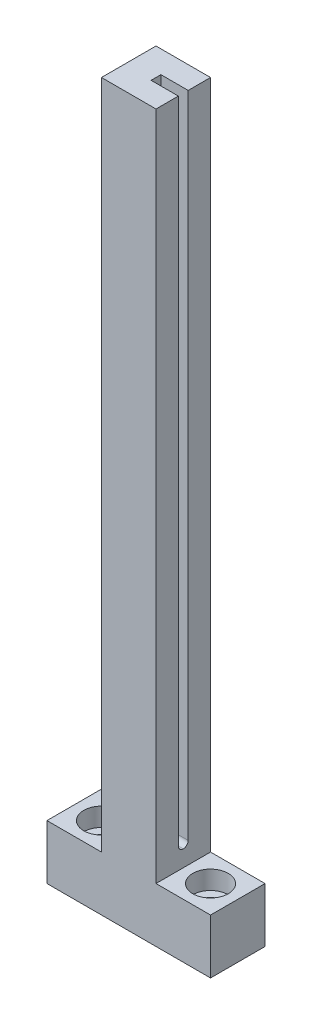
ISO-10303-21;
HEADER;
FILE_DESCRIPTION(('STEP AP214'),'2;1');
FILE_NAME('part.step','',(''),(''),'','','');
FILE_SCHEMA(('AUTOMOTIVE_DESIGN { 1 0 10303 214 1 1 1 1 }'));
ENDSEC;
DATA;
#1=APPLICATION_CONTEXT('core data for automotive mechanical design processes');
#2=APPLICATION_PROTOCOL_DEFINITION('international standard','automotive_design',2000,#1);
#3=PRODUCT_CONTEXT('',#1,'mechanical');
#4=PRODUCT('Part','Part','',(#3));
#5=PRODUCT_RELATED_PRODUCT_CATEGORY('part','',(#4));
#6=PRODUCT_DEFINITION_FORMATION('','',#4);
#7=PRODUCT_DEFINITION_CONTEXT('part definition',#1,'design');
#8=PRODUCT_DEFINITION('design','',#6,#7);
#9=PRODUCT_DEFINITION_SHAPE('','',#8);
#10=(LENGTH_UNIT() NAMED_UNIT(*) SI_UNIT(.MILLI.,.METRE.));
#11=(NAMED_UNIT(*) PLANE_ANGLE_UNIT() SI_UNIT($,.RADIAN.));
#12=(NAMED_UNIT(*) SI_UNIT($,.STERADIAN.) SOLID_ANGLE_UNIT());
#13=UNCERTAINTY_MEASURE_WITH_UNIT(LENGTH_MEASURE(1.E-05),#10,'distance_accuracy_value','');
#14=(GEOMETRIC_REPRESENTATION_CONTEXT(3) GLOBAL_UNCERTAINTY_ASSIGNED_CONTEXT((#13)) GLOBAL_UNIT_ASSIGNED_CONTEXT((#10,
#11,#12)) REPRESENTATION_CONTEXT('',''));
#15=CARTESIAN_POINT('',(0.,0.,0.));
#16=DIRECTION('',(0.,0.,1.));
#17=DIRECTION('',(1.,0.,0.));
#18=AXIS2_PLACEMENT_3D('',#15,#16,#17);
#19=CARTESIAN_POINT('',(5.,133.,-5.));
#20=DIRECTION('',(-1.,0.,0.));
#21=DIRECTION('',(0.,0.,1.));
#22=AXIS2_PLACEMENT_3D('',#19,#20,#21);
#23=PLANE('',#22);
#24=DIRECTION('',(0.,0.,1.));
#25=VECTOR('',#24,1.);
#26=CARTESIAN_POINT('',(5.,9.99999999999999,-5.));
#27=LINE('',#26,#25);
#28=CARTESIAN_POINT('',(5.,9.99999999999999,-5.));
#29=VERTEX_POINT('',#28);
#30=CARTESIAN_POINT('',(5.,10.,5.));
#31=VERTEX_POINT('',#30);
#32=EDGE_CURVE('E60',#29,#31,#27,.T.);
#33=ORIENTED_EDGE('',*,*,#32,.F.);
#34=DIRECTION('',(0.,-1.,0.));
#35=VECTOR('',#34,1.);
#36=CARTESIAN_POINT('',(5.,133.,-5.));
#37=LINE('',#36,#35);
#38=CARTESIAN_POINT('',(5.,133.,-5.));
#39=VERTEX_POINT('',#38);
#40=EDGE_CURVE('E290',#39,#29,#37,.T.);
#41=ORIENTED_EDGE('',*,*,#40,.F.);
#42=DIRECTION('',(0.,0.,-1.));
#43=VECTOR('',#42,1.);
#44=CARTESIAN_POINT('',(5.,133.,-5.));
#45=LINE('',#44,#43);
#46=CARTESIAN_POINT('',(5.,133.,-0.9));
#47=VERTEX_POINT('',#46);
#48=EDGE_CURVE('E267',#47,#39,#45,.T.);
#49=ORIENTED_EDGE('',*,*,#48,.F.);
#50=DIRECTION('',(0.,1.,0.));
#51=VECTOR('',#50,1.);
#52=CARTESIAN_POINT('',(5.,133.,-0.9));
#53=LINE('',#52,#51);
#54=CARTESIAN_POINT('',(5.,13.9,-0.899999999999986));
#55=VERTEX_POINT('',#54);
#56=EDGE_CURVE('E242',#55,#47,#53,.T.);
#57=ORIENTED_EDGE('',*,*,#56,.F.);
#58=CARTESIAN_POINT('',(5.,13.9,0.));
#59=DIRECTION('',(-1.,0.,0.));
#60=DIRECTION('',(0.,0.,1.));
#61=AXIS2_PLACEMENT_3D('',#58,#59,#60);
#62=CIRCLE('',#61,0.9);
#63=CARTESIAN_POINT('',(5.,13.,0.));
#64=VERTEX_POINT('',#63);
#65=EDGE_CURVE('E11',#55,#64,#62,.T.);
#66=ORIENTED_EDGE('',*,*,#65,.T.);
#67=CARTESIAN_POINT('',(5.,13.9,0.));
#68=DIRECTION('',(-1.,0.,0.));
#69=DIRECTION('',(0.,0.,1.));
#70=AXIS2_PLACEMENT_3D('',#67,#68,#69);
#71=CIRCLE('',#70,0.9);
#72=CARTESIAN_POINT('',(5.,13.9,0.899999999999985));
#73=VERTEX_POINT('',#72);
#74=EDGE_CURVE('E53',#64,#73,#71,.T.);
#75=ORIENTED_EDGE('',*,*,#74,.T.);
#76=DIRECTION('',(0.,-1.,0.));
#77=VECTOR('',#76,1.);
#78=CARTESIAN_POINT('',(5.,133.,0.9));
#79=LINE('',#78,#77);
#80=CARTESIAN_POINT('',(5.,133.,0.9));
#81=VERTEX_POINT('',#80);
#82=EDGE_CURVE('E250',#81,#73,#79,.T.);
#83=ORIENTED_EDGE('',*,*,#82,.F.);
#84=CARTESIAN_POINT('',(5.,133.,5.));
#85=VERTEX_POINT('',#84);
#86=EDGE_CURVE('E263',#85,#81,#45,.T.);
#87=ORIENTED_EDGE('',*,*,#86,.F.);
#88=DIRECTION('',(0.,-1.,0.));
#89=VECTOR('',#88,1.);
#90=CARTESIAN_POINT('',(5.,133.,5.));
#91=LINE('',#90,#89);
#92=EDGE_CURVE('E276',#85,#31,#91,.T.);
#93=ORIENTED_EDGE('',*,*,#92,.T.);
#94=EDGE_LOOP('',(#33,#41,#49,#57,#66,#75,#83,#87,#93));
#95=FACE_BOUND('',#94,.T.);
#96=ADVANCED_FACE('F43',(#95),#23,.F.);
#97=CARTESIAN_POINT('',(-5.,133.,-5.));
#98=DIRECTION('',(1.,0.,0.));
#99=DIRECTION('',(0.,0.,-1.));
#100=AXIS2_PLACEMENT_3D('',#97,#98,#99);
#101=PLANE('',#100);
#102=DIRECTION('',(0.,0.,-1.));
#103=VECTOR('',#102,1.);
#104=CARTESIAN_POINT('',(-5.,9.99999999999999,-5.));
#105=LINE('',#104,#103);
#106=CARTESIAN_POINT('',(-5.,9.99999999999999,5.));
#107=VERTEX_POINT('',#106);
#108=CARTESIAN_POINT('',(-5.,10.,-5.));
#109=VERTEX_POINT('',#108);
#110=EDGE_CURVE('E68',#107,#109,#105,.T.);
#111=ORIENTED_EDGE('',*,*,#110,.F.);
#112=DIRECTION('',(0.,-1.,0.));
#113=VECTOR('',#112,1.);
#114=CARTESIAN_POINT('',(-5.,133.,5.));
#115=LINE('',#114,#113);
#116=CARTESIAN_POINT('',(-5.,133.,5.));
#117=VERTEX_POINT('',#116);
#118=EDGE_CURVE('E284',#117,#107,#115,.T.);
#119=ORIENTED_EDGE('',*,*,#118,.F.);
#120=DIRECTION('',(0.,0.,1.));
#121=VECTOR('',#120,1.);
#122=CARTESIAN_POINT('',(-5.,133.,-5.));
#123=LINE('',#122,#121);
#124=CARTESIAN_POINT('',(-5.,133.,-5.));
#125=VERTEX_POINT('',#124);
#126=EDGE_CURVE('E270',#125,#117,#123,.T.);
#127=ORIENTED_EDGE('',*,*,#126,.F.);
#128=DIRECTION('',(0.,-1.,0.));
#129=VECTOR('',#128,1.);
#130=CARTESIAN_POINT('',(-5.,133.,-5.));
#131=LINE('',#130,#129);
#132=EDGE_CURVE('E287',#125,#109,#131,.T.);
#133=ORIENTED_EDGE('',*,*,#132,.T.);
#134=EDGE_LOOP('',(#111,#119,#127,#133));
#135=FACE_BOUND('',#134,.T.);
#136=ADVANCED_FACE('F415',(#135),#101,.F.);
#137=CARTESIAN_POINT('',(-5.,133.,-5.));
#138=DIRECTION('',(0.,0.,1.));
#139=DIRECTION('',(1.,0.,0.));
#140=AXIS2_PLACEMENT_3D('',#137,#138,#139);
#141=PLANE('',#140);
#142=DIRECTION('',(-1.,0.,0.));
#143=VECTOR('',#142,1.);
#144=CARTESIAN_POINT('',(-5.,0.,-5.));
#145=LINE('',#144,#143);
#146=CARTESIAN_POINT('',(15.,0.,-5.));
#147=VERTEX_POINT('',#146);
#148=CARTESIAN_POINT('',(-15.,0.,-5.));
#149=VERTEX_POINT('',#148);
#150=EDGE_CURVE('E259',#147,#149,#145,.T.);
#151=ORIENTED_EDGE('',*,*,#150,.T.);
#152=DIRECTION('',(0.,1.,0.));
#153=VECTOR('',#152,1.);
#154=CARTESIAN_POINT('',(-15.,0.,-5.));
#155=LINE('',#154,#153);
#156=CARTESIAN_POINT('',(-15.,10.,-5.));
#157=VERTEX_POINT('',#156);
#158=EDGE_CURVE('E218',#149,#157,#155,.T.);
#159=ORIENTED_EDGE('',*,*,#158,.T.);
#160=DIRECTION('',(-1.,0.,0.));
#161=VECTOR('',#160,1.);
#162=CARTESIAN_POINT('',(15.,10.,-5.));
#163=LINE('',#162,#161);
#164=EDGE_CURVE('E229',#109,#157,#163,.T.);
#165=ORIENTED_EDGE('',*,*,#164,.F.);
#166=ORIENTED_EDGE('',*,*,#132,.F.);
#167=DIRECTION('',(-1.,0.,0.));
#168=VECTOR('',#167,1.);
#169=CARTESIAN_POINT('',(-5.,133.,-5.));
#170=LINE('',#169,#168);
#171=EDGE_CURVE('E266',#39,#125,#170,.T.);
#172=ORIENTED_EDGE('',*,*,#171,.F.);
#173=ORIENTED_EDGE('',*,*,#40,.T.);
#174=CARTESIAN_POINT('',(15.,10.,-5.));
#175=VERTEX_POINT('',#174);
#176=EDGE_CURVE('E230',#175,#29,#163,.T.);
#177=ORIENTED_EDGE('',*,*,#176,.F.);
#178=DIRECTION('',(0.,1.,0.));
#179=VECTOR('',#178,1.);
#180=CARTESIAN_POINT('',(15.,0.,-5.));
#181=LINE('',#180,#179);
#182=EDGE_CURVE('E204',#147,#175,#181,.T.);
#183=ORIENTED_EDGE('',*,*,#182,.F.);
#184=EDGE_LOOP('',(#151,#159,#165,#166,#172,#173,#177,#183));
#185=FACE_BOUND('',#184,.T.);
#186=ADVANCED_FACE('F411',(#185),#141,.F.);
#187=CARTESIAN_POINT('',(-5.,133.,5.));
#188=DIRECTION('',(0.,0.,-1.));
#189=DIRECTION('',(-1.,0.,0.));
#190=AXIS2_PLACEMENT_3D('',#187,#188,#189);
#191=PLANE('',#190);
#192=DIRECTION('',(1.,0.,0.));
#193=VECTOR('',#192,1.);
#194=CARTESIAN_POINT('',(-5.,0.,5.));
#195=LINE('',#194,#193);
#196=CARTESIAN_POINT('',(-15.,0.,5.));
#197=VERTEX_POINT('',#196);
#198=CARTESIAN_POINT('',(15.,0.,5.));
#199=VERTEX_POINT('',#198);
#200=EDGE_CURVE('E279',#197,#199,#195,.T.);
#201=ORIENTED_EDGE('',*,*,#200,.T.);
#202=DIRECTION('',(0.,-1.,0.));
#203=VECTOR('',#202,1.);
#204=CARTESIAN_POINT('',(15.,0.,5.));
#205=LINE('',#204,#203);
#206=CARTESIAN_POINT('',(15.,10.,5.));
#207=VERTEX_POINT('',#206);
#208=EDGE_CURVE('E195',#207,#199,#205,.T.);
#209=ORIENTED_EDGE('',*,*,#208,.F.);
#210=DIRECTION('',(-1.,0.,0.));
#211=VECTOR('',#210,1.);
#212=CARTESIAN_POINT('',(15.,10.,5.));
#213=LINE('',#212,#211);
#214=EDGE_CURVE('E225',#207,#31,#213,.T.);
#215=ORIENTED_EDGE('',*,*,#214,.T.);
#216=ORIENTED_EDGE('',*,*,#92,.F.);
#217=DIRECTION('',(1.,0.,0.));
#218=VECTOR('',#217,1.);
#219=CARTESIAN_POINT('',(-5.,133.,5.));
#220=LINE('',#219,#218);
#221=EDGE_CURVE('E273',#117,#85,#220,.T.);
#222=ORIENTED_EDGE('',*,*,#221,.F.);
#223=ORIENTED_EDGE('',*,*,#118,.T.);
#224=CARTESIAN_POINT('',(-15.,10.,5.));
#225=VERTEX_POINT('',#224);
#226=EDGE_CURVE('E210',#107,#225,#213,.T.);
#227=ORIENTED_EDGE('',*,*,#226,.T.);
#228=DIRECTION('',(0.,-1.,0.));
#229=VECTOR('',#228,1.);
#230=CARTESIAN_POINT('',(-15.,0.,5.));
#231=LINE('',#230,#229);
#232=EDGE_CURVE('E194',#225,#197,#231,.T.);
#233=ORIENTED_EDGE('',*,*,#232,.T.);
#234=EDGE_LOOP('',(#201,#209,#215,#216,#222,#223,#227,#233));
#235=FACE_BOUND('',#234,.T.);
#236=ADVANCED_FACE('F386',(#235),#191,.F.);
#237=CARTESIAN_POINT('',(0.,133.,0.));
#238=DIRECTION('',(0.,1.,0.));
#239=DIRECTION('',(0.,0.,1.));
#240=AXIS2_PLACEMENT_3D('',#237,#238,#239);
#241=PLANE('',#240);
#242=DIRECTION('',(1.,0.,0.));
#243=VECTOR('',#242,1.);
#244=CARTESIAN_POINT('',(0.,133.,0.9));
#245=LINE('',#244,#243);
#246=CARTESIAN_POINT('',(0.,133.,0.9));
#247=VERTEX_POINT('',#246);
#248=EDGE_CURVE('E256',#247,#81,#245,.T.);
#249=ORIENTED_EDGE('',*,*,#248,.F.);
#250=DIRECTION('',(0.,0.,1.));
#251=VECTOR('',#250,1.);
#252=CARTESIAN_POINT('',(0.,133.,0.9));
#253=LINE('',#252,#251);
#254=CARTESIAN_POINT('',(0.,133.,-0.9));
#255=VERTEX_POINT('',#254);
#256=EDGE_CURVE('E245',#255,#247,#253,.T.);
#257=ORIENTED_EDGE('',*,*,#256,.F.);
#258=DIRECTION('',(1.,0.,0.));
#259=VECTOR('',#258,1.);
#260=CARTESIAN_POINT('',(0.,133.,-0.9));
#261=LINE('',#260,#259);
#262=EDGE_CURVE('E249',#255,#47,#261,.T.);
#263=ORIENTED_EDGE('',*,*,#262,.T.);
#264=ORIENTED_EDGE('',*,*,#48,.T.);
#265=ORIENTED_EDGE('',*,*,#171,.T.);
#266=ORIENTED_EDGE('',*,*,#126,.T.);
#267=ORIENTED_EDGE('',*,*,#221,.T.);
#268=ORIENTED_EDGE('',*,*,#86,.T.);
#269=EDGE_LOOP('',(#249,#257,#263,#264,#265,#266,#267,#268));
#270=FACE_BOUND('',#269,.T.);
#271=ADVANCED_FACE('F414',(#270),#241,.T.);
#272=CARTESIAN_POINT('',(0.,0.,0.));
#273=DIRECTION('',(0.,1.,0.));
#274=DIRECTION('',(0.,0.,1.));
#275=AXIS2_PLACEMENT_3D('',#272,#273,#274);
#276=PLANE('',#275);
#277=CARTESIAN_POINT('',(0.,0.,0.));
#278=DIRECTION('',(0.,-1.,0.));
#279=DIRECTION('',(0.,0.,-1.));
#280=AXIS2_PLACEMENT_3D('',#277,#278,#279);
#281=CIRCLE('',#280,0.49999999999999);
#282=CARTESIAN_POINT('',(0.,0.,-0.49999999999999));
#283=VERTEX_POINT('',#282);
#284=EDGE_CURVE('E154',#283,#283,#281,.T.);
#285=ORIENTED_EDGE('',*,*,#284,.F.);
#286=EDGE_LOOP('',(#285));
#287=FACE_BOUND('',#286,.T.);
#288=CARTESIAN_POINT('',(-10.,0.,0.));
#289=DIRECTION('',(0.,1.,0.));
#290=DIRECTION('',(0.,0.,1.));
#291=AXIS2_PLACEMENT_3D('',#288,#289,#290);
#292=CIRCLE('',#291,1.7);
#293=CARTESIAN_POINT('',(-10.,0.,1.7));
#294=VERTEX_POINT('',#293);
#295=EDGE_CURVE('E174',#294,#294,#292,.T.);
#296=ORIENTED_EDGE('',*,*,#295,.T.);
#297=EDGE_LOOP('',(#296));
#298=FACE_BOUND('',#297,.T.);
#299=CARTESIAN_POINT('',(10.,0.,0.));
#300=DIRECTION('',(0.,1.,0.));
#301=DIRECTION('',(0.,0.,1.));
#302=AXIS2_PLACEMENT_3D('',#299,#300,#301);
#303=CIRCLE('',#302,1.7);
#304=CARTESIAN_POINT('',(10.,0.,1.7));
#305=VERTEX_POINT('',#304);
#306=EDGE_CURVE('E190',#305,#305,#303,.T.);
#307=ORIENTED_EDGE('',*,*,#306,.T.);
#308=EDGE_LOOP('',(#307));
#309=FACE_BOUND('',#308,.T.);
#310=ORIENTED_EDGE('',*,*,#150,.F.);
#311=DIRECTION('',(0.,0.,-1.));
#312=VECTOR('',#311,1.);
#313=CARTESIAN_POINT('',(15.,0.,5.));
#314=LINE('',#313,#312);
#315=EDGE_CURVE('E199',#199,#147,#314,.T.);
#316=ORIENTED_EDGE('',*,*,#315,.F.);
#317=ORIENTED_EDGE('',*,*,#200,.F.);
#318=DIRECTION('',(0.,0.,-1.));
#319=VECTOR('',#318,1.);
#320=CARTESIAN_POINT('',(-15.,0.,5.));
#321=LINE('',#320,#319);
#322=EDGE_CURVE('E214',#197,#149,#321,.T.);
#323=ORIENTED_EDGE('',*,*,#322,.T.);
#324=EDGE_LOOP('',(#310,#316,#317,#323));
#325=FACE_BOUND('',#324,.T.);
#326=ADVANCED_FACE('F398',(#287,#298,#309,#325),#276,.F.);
#327=CARTESIAN_POINT('',(0.,133.,0.9));
#328=DIRECTION('',(0.,0.,1.));
#329=DIRECTION('',(0.,-1.,0.));
#330=AXIS2_PLACEMENT_3D('',#327,#328,#329);
#331=PLANE('',#330);
#332=ORIENTED_EDGE('',*,*,#82,.T.);
#333=DIRECTION('',(1.,0.,0.));
#334=VECTOR('',#333,1.);
#335=CARTESIAN_POINT('',(0.,13.9,0.899999999999985));
#336=LINE('',#335,#334);
#337=CARTESIAN_POINT('',(0.,13.9,0.899999999999985));
#338=VERTEX_POINT('',#337);
#339=EDGE_CURVE('E293',#73,#338,#336,.F.);
#340=ORIENTED_EDGE('',*,*,#339,.T.);
#341=DIRECTION('',(0.,-1.,0.));
#342=VECTOR('',#341,1.);
#343=CARTESIAN_POINT('',(0.,133.,0.9));
#344=LINE('',#343,#342);
#345=EDGE_CURVE('E237',#247,#338,#344,.T.);
#346=ORIENTED_EDGE('',*,*,#345,.F.);
#347=ORIENTED_EDGE('',*,*,#248,.T.);
#348=EDGE_LOOP('',(#332,#340,#346,#347));
#349=FACE_BOUND('',#348,.T.);
#350=ADVANCED_FACE('F319',(#349),#331,.F.);
#351=CARTESIAN_POINT('',(0.,133.,-0.9));
#352=DIRECTION('',(0.,0.,-1.));
#353=DIRECTION('',(0.,1.,0.));
#354=AXIS2_PLACEMENT_3D('',#351,#352,#353);
#355=PLANE('',#354);
#356=DIRECTION('',(0.,1.,0.));
#357=VECTOR('',#356,1.);
#358=CARTESIAN_POINT('',(0.,133.,-0.9));
#359=LINE('',#358,#357);
#360=CARTESIAN_POINT('',(0.,13.9,-0.899999999999985));
#361=VERTEX_POINT('',#360);
#362=EDGE_CURVE('E241',#361,#255,#359,.T.);
#363=ORIENTED_EDGE('',*,*,#362,.F.);
#364=DIRECTION('',(1.,0.,0.));
#365=VECTOR('',#364,1.);
#366=CARTESIAN_POINT('',(5.,13.9,-0.899999999999986));
#367=LINE('',#366,#365);
#368=EDGE_CURVE('E303',#361,#55,#367,.T.);
#369=ORIENTED_EDGE('',*,*,#368,.T.);
#370=ORIENTED_EDGE('',*,*,#56,.T.);
#371=ORIENTED_EDGE('',*,*,#262,.F.);
#372=EDGE_LOOP('',(#363,#369,#370,#371));
#373=FACE_BOUND('',#372,.T.);
#374=ADVANCED_FACE('F329',(#373),#355,.F.);
#375=CARTESIAN_POINT('',(0.,0.,0.));
#376=DIRECTION('',(1.,0.,0.));
#377=DIRECTION('',(0.,0.,-1.));
#378=AXIS2_PLACEMENT_3D('',#375,#376,#377);
#379=PLANE('',#378);
#380=ORIENTED_EDGE('',*,*,#345,.T.);
#381=CARTESIAN_POINT('',(0.,13.9,0.));
#382=DIRECTION('',(1.,0.,0.));
#383=DIRECTION('',(0.,0.,-1.));
#384=AXIS2_PLACEMENT_3D('',#381,#382,#383);
#385=CIRCLE('',#384,0.9);
#386=CARTESIAN_POINT('',(0.,13.,0.));
#387=VERTEX_POINT('',#386);
#388=EDGE_CURVE('E300',#338,#387,#385,.T.);
#389=ORIENTED_EDGE('',*,*,#388,.T.);
#390=CARTESIAN_POINT('',(0.,13.9,0.));
#391=DIRECTION('',(1.,0.,0.));
#392=DIRECTION('',(0.,0.,-1.));
#393=AXIS2_PLACEMENT_3D('',#390,#391,#392);
#394=CIRCLE('',#393,0.9);
#395=EDGE_CURVE('E297',#387,#361,#394,.T.);
#396=ORIENTED_EDGE('',*,*,#395,.T.);
#397=ORIENTED_EDGE('',*,*,#362,.T.);
#398=ORIENTED_EDGE('',*,*,#256,.T.);
#399=EDGE_LOOP('',(#380,#389,#396,#397,#398));
#400=FACE_BOUND('',#399,.T.);
#401=ADVANCED_FACE('F324',(#400),#379,.T.);
#402=CARTESIAN_POINT('',(0.,13.9,0.));
#403=DIRECTION('',(-1.,0.,0.));
#404=DIRECTION('',(0.,0.,1.));
#405=AXIS2_PLACEMENT_3D('',#402,#403,#404);
#406=CYLINDRICAL_SURFACE('',#405,0.9);
#407=ORIENTED_EDGE('',*,*,#368,.F.);
#408=ORIENTED_EDGE('',*,*,#395,.F.);
#409=DIRECTION('',(1.,0.,0.));
#410=VECTOR('',#409,1.);
#411=CARTESIAN_POINT('',(0.,13.,0.));
#412=LINE('',#411,#410);
#413=EDGE_CURVE('E47',#64,#387,#412,.F.);
#414=ORIENTED_EDGE('',*,*,#413,.F.);
#415=ORIENTED_EDGE('',*,*,#65,.F.);
#416=EDGE_LOOP('',(#407,#408,#414,#415));
#417=FACE_BOUND('',#416,.T.);
#418=ADVANCED_FACE('F45',(#417),#406,.F.);
#419=CARTESIAN_POINT('',(0.,13.9,0.));
#420=DIRECTION('',(-1.,0.,0.));
#421=DIRECTION('',(0.,0.,1.));
#422=AXIS2_PLACEMENT_3D('',#419,#420,#421);
#423=CYLINDRICAL_SURFACE('',#422,0.9);
#424=ORIENTED_EDGE('',*,*,#388,.F.);
#425=ORIENTED_EDGE('',*,*,#339,.F.);
#426=ORIENTED_EDGE('',*,*,#74,.F.);
#427=ORIENTED_EDGE('',*,*,#413,.T.);
#428=EDGE_LOOP('',(#424,#425,#426,#427));
#429=FACE_BOUND('',#428,.T.);
#430=ADVANCED_FACE('F321',(#429),#423,.F.);
#431=CARTESIAN_POINT('',(-15.,0.,0.));
#432=DIRECTION('',(-1.,0.,0.));
#433=DIRECTION('',(0.,0.,1.));
#434=AXIS2_PLACEMENT_3D('',#431,#432,#433);
#435=PLANE('',#434);
#436=ORIENTED_EDGE('',*,*,#232,.F.);
#437=DIRECTION('',(0.,0.,1.));
#438=VECTOR('',#437,1.);
#439=CARTESIAN_POINT('',(-15.,10.,5.));
#440=LINE('',#439,#438);
#441=EDGE_CURVE('E200',#157,#225,#440,.T.);
#442=ORIENTED_EDGE('',*,*,#441,.F.);
#443=ORIENTED_EDGE('',*,*,#158,.F.);
#444=ORIENTED_EDGE('',*,*,#322,.F.);
#445=EDGE_LOOP('',(#436,#442,#443,#444));
#446=FACE_BOUND('',#445,.T.);
#447=ADVANCED_FACE('F396',(#446),#435,.T.);
#448=CARTESIAN_POINT('',(15.,10.,5.));
#449=DIRECTION('',(0.,-1.,0.));
#450=DIRECTION('',(0.,0.,-1.));
#451=AXIS2_PLACEMENT_3D('',#448,#449,#450);
#452=PLANE('',#451);
#453=CARTESIAN_POINT('',(-10.,10.,0.));
#454=DIRECTION('',(0.,1.,0.));
#455=DIRECTION('',(0.,0.,1.));
#456=AXIS2_PLACEMENT_3D('',#453,#454,#455);
#457=CIRCLE('',#456,3.25);
#458=CARTESIAN_POINT('',(-10.,10.,3.25));
#459=VERTEX_POINT('',#458);
#460=EDGE_CURVE('E153',#459,#459,#457,.T.);
#461=ORIENTED_EDGE('',*,*,#460,.F.);
#462=EDGE_LOOP('',(#461));
#463=FACE_BOUND('',#462,.T.);
#464=ORIENTED_EDGE('',*,*,#226,.F.);
#465=ORIENTED_EDGE('',*,*,#110,.T.);
#466=ORIENTED_EDGE('',*,*,#164,.T.);
#467=ORIENTED_EDGE('',*,*,#441,.T.);
#468=EDGE_LOOP('',(#464,#465,#466,#467));
#469=FACE_BOUND('',#468,.T.);
#470=ADVANCED_FACE('F391',(#463,#469),#452,.F.);
#471=CARTESIAN_POINT('',(10.,10.,0.));
#472=DIRECTION('',(0.,1.,0.));
#473=DIRECTION('',(0.,0.,1.));
#474=AXIS2_PLACEMENT_3D('',#471,#472,#473);
#475=CIRCLE('',#474,3.25);
#476=CARTESIAN_POINT('',(10.,10.,3.25));
#477=VERTEX_POINT('',#476);
#478=EDGE_CURVE('E178',#477,#477,#475,.T.);
#479=ORIENTED_EDGE('',*,*,#478,.F.);
#480=EDGE_LOOP('',(#479));
#481=FACE_BOUND('',#480,.T.);
#482=ORIENTED_EDGE('',*,*,#176,.T.);
#483=ORIENTED_EDGE('',*,*,#32,.T.);
#484=ORIENTED_EDGE('',*,*,#214,.F.);
#485=DIRECTION('',(0.,0.,1.));
#486=VECTOR('',#485,1.);
#487=CARTESIAN_POINT('',(15.,10.,5.));
#488=LINE('',#487,#486);
#489=EDGE_CURVE('E207',#175,#207,#488,.T.);
#490=ORIENTED_EDGE('',*,*,#489,.F.);
#491=EDGE_LOOP('',(#482,#483,#484,#490));
#492=FACE_BOUND('',#491,.T.);
#493=ADVANCED_FACE('F409',(#481,#492),#452,.F.);
#494=CARTESIAN_POINT('',(15.,0.,0.));
#495=DIRECTION('',(-1.,0.,0.));
#496=DIRECTION('',(0.,0.,1.));
#497=AXIS2_PLACEMENT_3D('',#494,#495,#496);
#498=PLANE('',#497);
#499=ORIENTED_EDGE('',*,*,#208,.T.);
#500=ORIENTED_EDGE('',*,*,#315,.T.);
#501=ORIENTED_EDGE('',*,*,#182,.T.);
#502=ORIENTED_EDGE('',*,*,#489,.T.);
#503=EDGE_LOOP('',(#499,#500,#501,#502));
#504=FACE_BOUND('',#503,.T.);
#505=ADVANCED_FACE('F404',(#504),#498,.F.);
#506=CARTESIAN_POINT('',(10.,10.,0.));
#507=DIRECTION('',(0.,1.,0.));
#508=DIRECTION('',(0.,0.,1.));
#509=AXIS2_PLACEMENT_3D('',#506,#507,#508);
#510=CYLINDRICAL_SURFACE('',#509,1.7);
#511=ORIENTED_EDGE('',*,*,#306,.F.);
#512=EDGE_LOOP('',(#511));
#513=FACE_BOUND('',#512,.T.);
#514=CARTESIAN_POINT('',(10.,6.6,0.));
#515=DIRECTION('',(0.,1.,0.));
#516=DIRECTION('',(0.,0.,1.));
#517=AXIS2_PLACEMENT_3D('',#514,#515,#516);
#518=CIRCLE('',#517,1.7);
#519=CARTESIAN_POINT('',(10.,6.6,1.7));
#520=VERTEX_POINT('',#519);
#521=EDGE_CURVE('E186',#520,#520,#518,.T.);
#522=ORIENTED_EDGE('',*,*,#521,.T.);
#523=EDGE_LOOP('',(#522));
#524=FACE_BOUND('',#523,.T.);
#525=ADVANCED_FACE('F456',(#513,#524),#510,.F.);
#526=CARTESIAN_POINT('',(11.7,6.6,0.));
#527=DIRECTION('',(0.,-1.,0.));
#528=DIRECTION('',(0.,0.,-1.));
#529=AXIS2_PLACEMENT_3D('',#526,#527,#528);
#530=PLANE('',#529);
#531=ORIENTED_EDGE('',*,*,#521,.F.);
#532=EDGE_LOOP('',(#531));
#533=FACE_BOUND('',#532,.T.);
#534=CARTESIAN_POINT('',(10.,6.6,0.));
#535=DIRECTION('',(0.,1.,0.));
#536=DIRECTION('',(0.,0.,1.));
#537=AXIS2_PLACEMENT_3D('',#534,#535,#536);
#538=CIRCLE('',#537,3.25);
#539=CARTESIAN_POINT('',(10.,6.6,3.25));
#540=VERTEX_POINT('',#539);
#541=EDGE_CURVE('E182',#540,#540,#538,.T.);
#542=ORIENTED_EDGE('',*,*,#541,.T.);
#543=EDGE_LOOP('',(#542));
#544=FACE_BOUND('',#543,.T.);
#545=ADVANCED_FACE('F459',(#533,#544),#530,.F.);
#546=CARTESIAN_POINT('',(10.,10.,0.));
#547=DIRECTION('',(0.,1.,0.));
#548=DIRECTION('',(0.,0.,1.));
#549=AXIS2_PLACEMENT_3D('',#546,#547,#548);
#550=CYLINDRICAL_SURFACE('',#549,3.25);
#551=ORIENTED_EDGE('',*,*,#541,.F.);
#552=EDGE_LOOP('',(#551));
#553=FACE_BOUND('',#552,.T.);
#554=ORIENTED_EDGE('',*,*,#478,.T.);
#555=EDGE_LOOP('',(#554));
#556=FACE_BOUND('',#555,.T.);
#557=ADVANCED_FACE('F465',(#553,#556),#550,.F.);
#558=CARTESIAN_POINT('',(-10.,10.,0.));
#559=DIRECTION('',(0.,1.,0.));
#560=DIRECTION('',(0.,0.,1.));
#561=AXIS2_PLACEMENT_3D('',#558,#559,#560);
#562=CYLINDRICAL_SURFACE('',#561,1.7);
#563=ORIENTED_EDGE('',*,*,#295,.F.);
#564=EDGE_LOOP('',(#563));
#565=FACE_BOUND('',#564,.T.);
#566=CARTESIAN_POINT('',(-10.,6.6,0.));
#567=DIRECTION('',(0.,1.,0.));
#568=DIRECTION('',(0.,0.,1.));
#569=AXIS2_PLACEMENT_3D('',#566,#567,#568);
#570=CIRCLE('',#569,1.7);
#571=CARTESIAN_POINT('',(-10.,6.6,1.7));
#572=VERTEX_POINT('',#571);
#573=EDGE_CURVE('E170',#572,#572,#570,.T.);
#574=ORIENTED_EDGE('',*,*,#573,.T.);
#575=EDGE_LOOP('',(#574));
#576=FACE_BOUND('',#575,.T.);
#577=ADVANCED_FACE('F471',(#565,#576),#562,.F.);
#578=CARTESIAN_POINT('',(-8.3,6.6,0.));
#579=DIRECTION('',(0.,-1.,0.));
#580=DIRECTION('',(0.,0.,-1.));
#581=AXIS2_PLACEMENT_3D('',#578,#579,#580);
#582=PLANE('',#581);
#583=ORIENTED_EDGE('',*,*,#573,.F.);
#584=EDGE_LOOP('',(#583));
#585=FACE_BOUND('',#584,.T.);
#586=CARTESIAN_POINT('',(-10.,6.6,0.));
#587=DIRECTION('',(0.,1.,0.));
#588=DIRECTION('',(0.,0.,1.));
#589=AXIS2_PLACEMENT_3D('',#586,#587,#588);
#590=CIRCLE('',#589,3.25);
#591=CARTESIAN_POINT('',(-10.,6.6,3.25));
#592=VERTEX_POINT('',#591);
#593=EDGE_CURVE('E161',#592,#592,#590,.T.);
#594=ORIENTED_EDGE('',*,*,#593,.T.);
#595=EDGE_LOOP('',(#594));
#596=FACE_BOUND('',#595,.T.);
#597=ADVANCED_FACE('F487',(#585,#596),#582,.F.);
#598=CARTESIAN_POINT('',(-10.,10.,0.));
#599=DIRECTION('',(0.,1.,0.));
#600=DIRECTION('',(0.,0.,1.));
#601=AXIS2_PLACEMENT_3D('',#598,#599,#600);
#602=CYLINDRICAL_SURFACE('',#601,3.25);
#603=ORIENTED_EDGE('',*,*,#593,.F.);
#604=EDGE_LOOP('',(#603));
#605=FACE_BOUND('',#604,.T.);
#606=ORIENTED_EDGE('',*,*,#460,.T.);
#607=EDGE_LOOP('',(#606));
#608=FACE_BOUND('',#607,.T.);
#609=ADVANCED_FACE('F146',(#605,#608),#602,.F.);
#610=CARTESIAN_POINT('',(0.,8.,0.));
#611=DIRECTION('',(0.,-1.,0.));
#612=DIRECTION('',(0.,0.,-1.));
#613=AXIS2_PLACEMENT_3D('',#610,#611,#612);
#614=CONICAL_SURFACE('',#613,0.499999999999998,1.02974425867665);
#615=CARTESIAN_POINT('',(0.,8.30043030951378,0.));
#616=VERTEX_POINT('',#615);
#617=VERTEX_LOOP('',#616);
#618=FACE_BOUND('',#617,.T.);
#619=CARTESIAN_POINT('',(0.,8.,0.));
#620=DIRECTION('',(0.,-1.,0.));
#621=DIRECTION('',(0.,0.,-1.));
#622=AXIS2_PLACEMENT_3D('',#619,#620,#621);
#623=CIRCLE('',#622,0.499999999999998);
#624=CARTESIAN_POINT('',(0.,8.,-0.499999999999998));
#625=VERTEX_POINT('',#624);
#626=EDGE_CURVE('E150',#625,#625,#623,.T.);
#627=ORIENTED_EDGE('',*,*,#626,.T.);
#628=EDGE_LOOP('',(#627));
#629=FACE_BOUND('',#628,.T.);
#630=ADVANCED_FACE('F142',(#618,#629),#614,.F.);
#631=CARTESIAN_POINT('',(0.,0.,0.));
#632=DIRECTION('',(0.,-1.,0.));
#633=DIRECTION('',(0.,0.,-1.));
#634=AXIS2_PLACEMENT_3D('',#631,#632,#633);
#635=CYLINDRICAL_SURFACE('',#634,0.499999999999994);
#636=ORIENTED_EDGE('',*,*,#626,.F.);
#637=EDGE_LOOP('',(#636));
#638=FACE_BOUND('',#637,.T.);
#639=ORIENTED_EDGE('',*,*,#284,.T.);
#640=EDGE_LOOP('',(#639));
#641=FACE_BOUND('',#640,.T.);
#642=ADVANCED_FACE('F145',(#638,#641),#635,.F.);
#643=CLOSED_SHELL('',(#96,#136,#186,#236,#271,#326,#350,#374,#401,#418,#430,#447,#470,#493,#505,
#525,#545,#557,#577,#597,#609,#630,#642));
#644=MANIFOLD_SOLID_BREP('B2',#643);
#645=ADVANCED_BREP_SHAPE_REPRESENTATION('',(#18,#644),#14);
#646=SHAPE_DEFINITION_REPRESENTATION(#9,#645);
ENDSEC;
END-ISO-10303-21;
